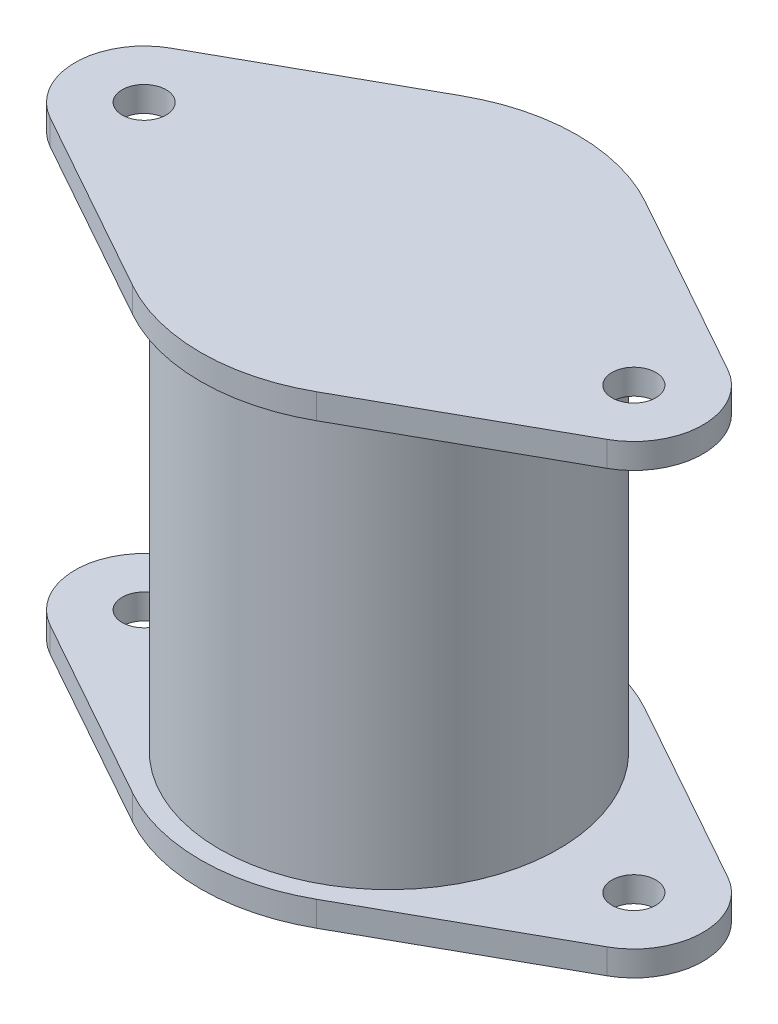
ISO-10303-21;
HEADER;
FILE_DESCRIPTION(('STEP AP214'),'2;1');
FILE_NAME('part.step','',(''),(''),'','','');
FILE_SCHEMA(('AUTOMOTIVE_DESIGN { 1 0 10303 214 1 1 1 1 }'));
ENDSEC;
DATA;
#1=APPLICATION_CONTEXT('core data for automotive mechanical design processes');
#2=APPLICATION_PROTOCOL_DEFINITION('international standard','automotive_design',2000,#1);
#3=PRODUCT_CONTEXT('',#1,'mechanical');
#4=PRODUCT('Part','Part','',(#3));
#5=PRODUCT_RELATED_PRODUCT_CATEGORY('part','',(#4));
#6=PRODUCT_DEFINITION_FORMATION('','',#4);
#7=PRODUCT_DEFINITION_CONTEXT('part definition',#1,'design');
#8=PRODUCT_DEFINITION('design','',#6,#7);
#9=PRODUCT_DEFINITION_SHAPE('','',#8);
#10=(LENGTH_UNIT() NAMED_UNIT(*) SI_UNIT(.MILLI.,.METRE.));
#11=(NAMED_UNIT(*) PLANE_ANGLE_UNIT() SI_UNIT($,.RADIAN.));
#12=(NAMED_UNIT(*) SI_UNIT($,.STERADIAN.) SOLID_ANGLE_UNIT());
#13=UNCERTAINTY_MEASURE_WITH_UNIT(LENGTH_MEASURE(1.E-05),#10,'distance_accuracy_value','');
#14=(GEOMETRIC_REPRESENTATION_CONTEXT(3) GLOBAL_UNCERTAINTY_ASSIGNED_CONTEXT((#13)) GLOBAL_UNIT_ASSIGNED_CONTEXT((#10,
#11,#12)) REPRESENTATION_CONTEXT('',''));
#15=CARTESIAN_POINT('',(0.,0.,0.));
#16=DIRECTION('',(0.,0.,1.));
#17=DIRECTION('',(1.,0.,0.));
#18=AXIS2_PLACEMENT_3D('',#15,#16,#17);
#19=CARTESIAN_POINT('',(-7.30769230769231,-2.,13.0995279737895));
#20=DIRECTION('',(-0.487179487179487,0.,0.873301864919303));
#21=DIRECTION('',(0.873301864919303,0.,0.487179487179487));
#22=AXIS2_PLACEMENT_3D('',#19,#20,#21);
#23=PLANE('',#22);
#24=DIRECTION('',(0.873301864919303,0.,0.487179487179487));
#25=VECTOR('',#24,1.);
#26=CARTESIAN_POINT('',(-7.30769230769231,0.,13.0995279737895));
#27=LINE('',#26,#25);
#28=CARTESIAN_POINT('',(-22.1794871794872,0.,4.80316025705616));
#29=VERTEX_POINT('',#28);
#30=CARTESIAN_POINT('',(-7.30769230769231,0.,13.0995279737895));
#31=VERTEX_POINT('',#30);
#32=EDGE_CURVE('E156',#29,#31,#27,.T.);
#33=ORIENTED_EDGE('',*,*,#32,.F.);
#34=DIRECTION('',(0.,1.,0.));
#35=VECTOR('',#34,1.);
#36=CARTESIAN_POINT('',(-22.1794871794872,-2.,4.80316025705616));
#37=LINE('',#36,#35);
#38=CARTESIAN_POINT('',(-22.1794871794872,-2.,4.80316025705616));
#39=VERTEX_POINT('',#38);
#40=EDGE_CURVE('E11',#39,#29,#37,.T.);
#41=ORIENTED_EDGE('',*,*,#40,.F.);
#42=DIRECTION('',(0.873301864919303,0.,0.487179487179487));
#43=VECTOR('',#42,1.);
#44=CARTESIAN_POINT('',(-7.30769230769231,-2.,13.0995279737895));
#45=LINE('',#44,#43);
#46=CARTESIAN_POINT('',(-7.30769230769231,-2.,13.0995279737895));
#47=VERTEX_POINT('',#46);
#48=EDGE_CURVE('E184',#39,#47,#45,.T.);
#49=ORIENTED_EDGE('',*,*,#48,.T.);
#50=DIRECTION('',(0.,1.,0.));
#51=VECTOR('',#50,1.);
#52=CARTESIAN_POINT('',(-7.30769230769231,-2.,13.0995279737895));
#53=LINE('',#52,#51);
#54=EDGE_CURVE('E46',#47,#31,#53,.T.);
#55=ORIENTED_EDGE('',*,*,#54,.T.);
#56=EDGE_LOOP('',(#33,#41,#49,#55));
#57=FACE_BOUND('',#56,.T.);
#58=ADVANCED_FACE('F42',(#57),#23,.T.);
#59=CARTESIAN_POINT('',(-19.5,-2.,0.));
#60=DIRECTION('',(0.,1.,0.));
#61=DIRECTION('',(0.,0.,1.));
#62=AXIS2_PLACEMENT_3D('',#59,#60,#61);
#63=CYLINDRICAL_SURFACE('',#62,5.5);
#64=CARTESIAN_POINT('',(-19.5,0.,0.));
#65=DIRECTION('',(0.,1.,0.));
#66=DIRECTION('',(0.,0.,1.));
#67=AXIS2_PLACEMENT_3D('',#64,#65,#66);
#68=CIRCLE('',#67,5.5);
#69=CARTESIAN_POINT('',(-22.1794871794872,0.,-4.80316025705616));
#70=VERTEX_POINT('',#69);
#71=EDGE_CURVE('E174',#70,#29,#68,.T.);
#72=ORIENTED_EDGE('',*,*,#71,.F.);
#73=DIRECTION('',(0.,1.,0.));
#74=VECTOR('',#73,1.);
#75=CARTESIAN_POINT('',(-22.1794871794872,-2.,-4.80316025705616));
#76=LINE('',#75,#74);
#77=CARTESIAN_POINT('',(-22.1794871794872,-2.,-4.80316025705616));
#78=VERTEX_POINT('',#77);
#79=EDGE_CURVE('E52',#78,#70,#76,.T.);
#80=ORIENTED_EDGE('',*,*,#79,.F.);
#81=CARTESIAN_POINT('',(-19.5,-2.,0.));
#82=DIRECTION('',(0.,1.,0.));
#83=DIRECTION('',(0.,0.,1.));
#84=AXIS2_PLACEMENT_3D('',#81,#82,#83);
#85=CIRCLE('',#84,5.5);
#86=EDGE_CURVE('E134',#78,#39,#85,.T.);
#87=ORIENTED_EDGE('',*,*,#86,.T.);
#88=ORIENTED_EDGE('',*,*,#40,.T.);
#89=EDGE_LOOP('',(#72,#80,#87,#88));
#90=FACE_BOUND('',#89,.T.);
#91=ADVANCED_FACE('F222',(#90),#63,.T.);
#92=CARTESIAN_POINT('',(-7.30769230769231,-2.,-13.0995279737895));
#93=DIRECTION('',(0.487179487179487,0.,0.873301864919303));
#94=DIRECTION('',(0.873301864919303,0.,-0.487179487179487));
#95=AXIS2_PLACEMENT_3D('',#92,#93,#94);
#96=PLANE('',#95);
#97=DIRECTION('',(0.873301864919303,0.,-0.487179487179487));
#98=VECTOR('',#97,1.);
#99=CARTESIAN_POINT('',(-7.30769230769231,0.,-13.0995279737895));
#100=LINE('',#99,#98);
#101=CARTESIAN_POINT('',(-7.30769230769231,0.,-13.0995279737895));
#102=VERTEX_POINT('',#101);
#103=EDGE_CURVE('E137',#70,#102,#100,.T.);
#104=ORIENTED_EDGE('',*,*,#103,.T.);
#105=DIRECTION('',(0.,1.,0.));
#106=VECTOR('',#105,1.);
#107=CARTESIAN_POINT('',(-7.30769230769231,-2.,-13.0995279737895));
#108=LINE('',#107,#106);
#109=CARTESIAN_POINT('',(-7.30769230769231,-2.,-13.0995279737895));
#110=VERTEX_POINT('',#109);
#111=EDGE_CURVE('E124',#110,#102,#108,.T.);
#112=ORIENTED_EDGE('',*,*,#111,.F.);
#113=DIRECTION('',(0.873301864919303,0.,-0.487179487179487));
#114=VECTOR('',#113,1.);
#115=CARTESIAN_POINT('',(-7.30769230769231,-2.,-13.0995279737895));
#116=LINE('',#115,#114);
#117=EDGE_CURVE('E129',#78,#110,#116,.T.);
#118=ORIENTED_EDGE('',*,*,#117,.F.);
#119=ORIENTED_EDGE('',*,*,#79,.T.);
#120=EDGE_LOOP('',(#104,#112,#118,#119));
#121=FACE_BOUND('',#120,.T.);
#122=ADVANCED_FACE('F136',(#121),#96,.F.);
#123=CARTESIAN_POINT('',(0.,-2.,0.));
#124=DIRECTION('',(0.,1.,0.));
#125=DIRECTION('',(0.,0.,1.));
#126=AXIS2_PLACEMENT_3D('',#123,#124,#125);
#127=CYLINDRICAL_SURFACE('',#126,15.);
#128=CARTESIAN_POINT('',(0.,0.,0.));
#129=DIRECTION('',(0.,1.,0.));
#130=DIRECTION('',(0.,0.,1.));
#131=AXIS2_PLACEMENT_3D('',#128,#129,#130);
#132=CIRCLE('',#131,15.);
#133=CARTESIAN_POINT('',(7.3076923076923,0.,-13.0995279737895));
#134=VERTEX_POINT('',#133);
#135=EDGE_CURVE('E171',#102,#134,#132,.F.);
#136=ORIENTED_EDGE('',*,*,#135,.T.);
#137=DIRECTION('',(0.,1.,0.));
#138=VECTOR('',#137,1.);
#139=CARTESIAN_POINT('',(7.3076923076923,-2.,-13.0995279737895));
#140=LINE('',#139,#138);
#141=CARTESIAN_POINT('',(7.3076923076923,-2.,-13.0995279737895));
#142=VERTEX_POINT('',#141);
#143=EDGE_CURVE('E125',#142,#134,#140,.T.);
#144=ORIENTED_EDGE('',*,*,#143,.F.);
#145=CARTESIAN_POINT('',(0.,-2.,0.));
#146=DIRECTION('',(0.,1.,0.));
#147=DIRECTION('',(0.,0.,1.));
#148=AXIS2_PLACEMENT_3D('',#145,#146,#147);
#149=CIRCLE('',#148,15.);
#150=EDGE_CURVE('E119',#110,#142,#149,.F.);
#151=ORIENTED_EDGE('',*,*,#150,.F.);
#152=ORIENTED_EDGE('',*,*,#111,.T.);
#153=EDGE_LOOP('',(#136,#144,#151,#152));
#154=FACE_BOUND('',#153,.T.);
#155=ADVANCED_FACE('F122',(#154),#127,.T.);
#156=CARTESIAN_POINT('',(7.3076923076923,-2.,-13.0995279737895));
#157=DIRECTION('',(0.487179487179487,0.,-0.873301864919303));
#158=DIRECTION('',(-0.873301864919303,0.,-0.487179487179487));
#159=AXIS2_PLACEMENT_3D('',#156,#157,#158);
#160=PLANE('',#159);
#161=DIRECTION('',(-0.873301864919303,0.,-0.487179487179487));
#162=VECTOR('',#161,1.);
#163=CARTESIAN_POINT('',(7.3076923076923,0.,-13.0995279737895));
#164=LINE('',#163,#162);
#165=CARTESIAN_POINT('',(22.1794871794872,0.,-4.80316025705616));
#166=VERTEX_POINT('',#165);
#167=EDGE_CURVE('E168',#166,#134,#164,.T.);
#168=ORIENTED_EDGE('',*,*,#167,.F.);
#169=DIRECTION('',(0.,1.,0.));
#170=VECTOR('',#169,1.);
#171=CARTESIAN_POINT('',(22.1794871794872,-2.,-4.80316025705616));
#172=LINE('',#171,#170);
#173=CARTESIAN_POINT('',(22.1794871794872,-2.,-4.80316025705616));
#174=VERTEX_POINT('',#173);
#175=EDGE_CURVE('E140',#174,#166,#172,.T.);
#176=ORIENTED_EDGE('',*,*,#175,.F.);
#177=DIRECTION('',(-0.873301864919303,0.,-0.487179487179487));
#178=VECTOR('',#177,1.);
#179=CARTESIAN_POINT('',(7.3076923076923,-2.,-13.0995279737895));
#180=LINE('',#179,#178);
#181=EDGE_CURVE('E130',#174,#142,#180,.T.);
#182=ORIENTED_EDGE('',*,*,#181,.T.);
#183=ORIENTED_EDGE('',*,*,#143,.T.);
#184=EDGE_LOOP('',(#168,#176,#182,#183));
#185=FACE_BOUND('',#184,.T.);
#186=ADVANCED_FACE('F200',(#185),#160,.T.);
#187=CARTESIAN_POINT('',(19.5,-2.,0.));
#188=DIRECTION('',(0.,1.,0.));
#189=DIRECTION('',(0.,0.,1.));
#190=AXIS2_PLACEMENT_3D('',#187,#188,#189);
#191=CYLINDRICAL_SURFACE('',#190,5.5);
#192=CARTESIAN_POINT('',(19.5,0.,0.));
#193=DIRECTION('',(0.,1.,0.));
#194=DIRECTION('',(0.,0.,1.));
#195=AXIS2_PLACEMENT_3D('',#192,#193,#194);
#196=CIRCLE('',#195,5.5);
#197=CARTESIAN_POINT('',(22.1794871794872,0.,4.80316025705616));
#198=VERTEX_POINT('',#197);
#199=EDGE_CURVE('E165',#198,#166,#196,.T.);
#200=ORIENTED_EDGE('',*,*,#199,.F.);
#201=DIRECTION('',(0.,1.,0.));
#202=VECTOR('',#201,1.);
#203=CARTESIAN_POINT('',(22.1794871794872,-2.,4.80316025705616));
#204=LINE('',#203,#202);
#205=CARTESIAN_POINT('',(22.1794871794872,-2.,4.80316025705616));
#206=VERTEX_POINT('',#205);
#207=EDGE_CURVE('E144',#206,#198,#204,.T.);
#208=ORIENTED_EDGE('',*,*,#207,.F.);
#209=CARTESIAN_POINT('',(19.5,-2.,0.));
#210=DIRECTION('',(0.,1.,0.));
#211=DIRECTION('',(0.,0.,1.));
#212=AXIS2_PLACEMENT_3D('',#209,#210,#211);
#213=CIRCLE('',#212,5.5);
#214=EDGE_CURVE('E195',#206,#174,#213,.T.);
#215=ORIENTED_EDGE('',*,*,#214,.T.);
#216=ORIENTED_EDGE('',*,*,#175,.T.);
#217=EDGE_LOOP('',(#200,#208,#215,#216));
#218=FACE_BOUND('',#217,.T.);
#219=ADVANCED_FACE('F205',(#218),#191,.T.);
#220=CARTESIAN_POINT('',(7.3076923076923,-2.,13.0995279737895));
#221=DIRECTION('',(0.487179487179487,0.,0.873301864919303));
#222=DIRECTION('',(0.873301864919303,0.,-0.487179487179487));
#223=AXIS2_PLACEMENT_3D('',#220,#221,#222);
#224=PLANE('',#223);
#225=DIRECTION('',(0.873301864919303,0.,-0.487179487179487));
#226=VECTOR('',#225,1.);
#227=CARTESIAN_POINT('',(7.3076923076923,0.,13.0995279737895));
#228=LINE('',#227,#226);
#229=CARTESIAN_POINT('',(7.3076923076923,0.,13.0995279737895));
#230=VERTEX_POINT('',#229);
#231=EDGE_CURVE('E162',#230,#198,#228,.T.);
#232=ORIENTED_EDGE('',*,*,#231,.F.);
#233=DIRECTION('',(0.,1.,0.));
#234=VECTOR('',#233,1.);
#235=CARTESIAN_POINT('',(7.3076923076923,-2.,13.0995279737895));
#236=LINE('',#235,#234);
#237=CARTESIAN_POINT('',(7.3076923076923,-2.,13.0995279737895));
#238=VERTEX_POINT('',#237);
#239=EDGE_CURVE('E145',#238,#230,#236,.T.);
#240=ORIENTED_EDGE('',*,*,#239,.F.);
#241=DIRECTION('',(0.873301864919303,0.,-0.487179487179487));
#242=VECTOR('',#241,1.);
#243=CARTESIAN_POINT('',(7.3076923076923,-2.,13.0995279737895));
#244=LINE('',#243,#242);
#245=EDGE_CURVE('E192',#238,#206,#244,.T.);
#246=ORIENTED_EDGE('',*,*,#245,.T.);
#247=ORIENTED_EDGE('',*,*,#207,.T.);
#248=EDGE_LOOP('',(#232,#240,#246,#247));
#249=FACE_BOUND('',#248,.T.);
#250=ADVANCED_FACE('F207',(#249),#224,.T.);
#251=CARTESIAN_POINT('',(19.5,-2.,0.));
#252=DIRECTION('',(0.,1.,0.));
#253=DIRECTION('',(0.,0.,1.));
#254=AXIS2_PLACEMENT_3D('',#251,#252,#253);
#255=CYLINDRICAL_SURFACE('',#254,1.75);
#256=CARTESIAN_POINT('',(19.5,-2.,0.));
#257=DIRECTION('',(0.,1.,0.));
#258=DIRECTION('',(0.,0.,1.));
#259=AXIS2_PLACEMENT_3D('',#256,#257,#258);
#260=CIRCLE('',#259,1.75);
#261=CARTESIAN_POINT('',(19.5,-2.,1.75));
#262=VERTEX_POINT('',#261);
#263=EDGE_CURVE('E179',#262,#262,#260,.T.);
#264=ORIENTED_EDGE('',*,*,#263,.F.);
#265=EDGE_LOOP('',(#264));
#266=FACE_BOUND('',#265,.T.);
#267=CARTESIAN_POINT('',(19.5,0.,0.));
#268=DIRECTION('',(0.,1.,0.));
#269=DIRECTION('',(0.,0.,1.));
#270=AXIS2_PLACEMENT_3D('',#267,#268,#269);
#271=CIRCLE('',#270,1.75);
#272=CARTESIAN_POINT('',(19.5,0.,1.75));
#273=VERTEX_POINT('',#272);
#274=EDGE_CURVE('E152',#273,#273,#271,.T.);
#275=ORIENTED_EDGE('',*,*,#274,.T.);
#276=EDGE_LOOP('',(#275));
#277=FACE_BOUND('',#276,.T.);
#278=ADVANCED_FACE('F217',(#266,#277),#255,.F.);
#279=CARTESIAN_POINT('',(-19.5,-2.,0.));
#280=DIRECTION('',(0.,1.,0.));
#281=DIRECTION('',(0.,0.,1.));
#282=AXIS2_PLACEMENT_3D('',#279,#280,#281);
#283=CYLINDRICAL_SURFACE('',#282,1.75);
#284=CARTESIAN_POINT('',(-19.5,-2.,0.));
#285=DIRECTION('',(0.,1.,0.));
#286=DIRECTION('',(0.,0.,1.));
#287=AXIS2_PLACEMENT_3D('',#284,#285,#286);
#288=CIRCLE('',#287,1.75);
#289=CARTESIAN_POINT('',(-19.5,-2.,1.75));
#290=VERTEX_POINT('',#289);
#291=EDGE_CURVE('E176',#290,#290,#288,.T.);
#292=ORIENTED_EDGE('',*,*,#291,.F.);
#293=EDGE_LOOP('',(#292));
#294=FACE_BOUND('',#293,.T.);
#295=CARTESIAN_POINT('',(-19.5,0.,0.));
#296=DIRECTION('',(0.,1.,0.));
#297=DIRECTION('',(0.,0.,1.));
#298=AXIS2_PLACEMENT_3D('',#295,#296,#297);
#299=CIRCLE('',#298,1.75);
#300=CARTESIAN_POINT('',(-19.5,0.,1.75));
#301=VERTEX_POINT('',#300);
#302=EDGE_CURVE('E149',#301,#301,#299,.T.);
#303=ORIENTED_EDGE('',*,*,#302,.T.);
#304=EDGE_LOOP('',(#303));
#305=FACE_BOUND('',#304,.T.);
#306=ADVANCED_FACE('F44',(#294,#305),#283,.F.);
#307=CARTESIAN_POINT('',(0.,-2.,0.));
#308=DIRECTION('',(0.,1.,0.));
#309=DIRECTION('',(0.,0.,1.));
#310=AXIS2_PLACEMENT_3D('',#307,#308,#309);
#311=CYLINDRICAL_SURFACE('',#310,15.);
#312=CARTESIAN_POINT('',(0.,0.,0.));
#313=DIRECTION('',(0.,1.,0.));
#314=DIRECTION('',(0.,0.,1.));
#315=AXIS2_PLACEMENT_3D('',#312,#313,#314);
#316=CIRCLE('',#315,15.);
#317=EDGE_CURVE('E159',#31,#230,#316,.T.);
#318=ORIENTED_EDGE('',*,*,#317,.F.);
#319=ORIENTED_EDGE('',*,*,#54,.F.);
#320=CARTESIAN_POINT('',(0.,-2.,0.));
#321=DIRECTION('',(0.,1.,0.));
#322=DIRECTION('',(0.,0.,1.));
#323=AXIS2_PLACEMENT_3D('',#320,#321,#322);
#324=CIRCLE('',#323,15.);
#325=EDGE_CURVE('E190',#47,#238,#324,.T.);
#326=ORIENTED_EDGE('',*,*,#325,.T.);
#327=ORIENTED_EDGE('',*,*,#239,.T.);
#328=EDGE_LOOP('',(#318,#319,#326,#327));
#329=FACE_BOUND('',#328,.T.);
#330=ADVANCED_FACE('F208',(#329),#311,.T.);
#331=CARTESIAN_POINT('',(0.,-2.,0.));
#332=DIRECTION('',(0.,1.,0.));
#333=DIRECTION('',(0.,0.,1.));
#334=AXIS2_PLACEMENT_3D('',#331,#332,#333);
#335=PLANE('',#334);
#336=ORIENTED_EDGE('',*,*,#291,.T.);
#337=EDGE_LOOP('',(#336));
#338=FACE_BOUND('',#337,.T.);
#339=ORIENTED_EDGE('',*,*,#263,.T.);
#340=EDGE_LOOP('',(#339));
#341=FACE_BOUND('',#340,.T.);
#342=ORIENTED_EDGE('',*,*,#48,.F.);
#343=ORIENTED_EDGE('',*,*,#86,.F.);
#344=ORIENTED_EDGE('',*,*,#117,.T.);
#345=ORIENTED_EDGE('',*,*,#150,.T.);
#346=ORIENTED_EDGE('',*,*,#181,.F.);
#347=ORIENTED_EDGE('',*,*,#214,.F.);
#348=ORIENTED_EDGE('',*,*,#245,.F.);
#349=ORIENTED_EDGE('',*,*,#325,.F.);
#350=EDGE_LOOP('',(#342,#343,#344,#345,#346,#347,#348,#349));
#351=FACE_BOUND('',#350,.T.);
#352=ADVANCED_FACE('F133',(#338,#341,#351),#335,.F.);
#353=CARTESIAN_POINT('',(0.,0.,0.));
#354=DIRECTION('',(0.,1.,0.));
#355=DIRECTION('',(0.,0.,1.));
#356=AXIS2_PLACEMENT_3D('',#353,#354,#355);
#357=PLANE('',#356);
#358=CARTESIAN_POINT('',(0.,0.,0.));
#359=DIRECTION('',(0.,1.,0.));
#360=DIRECTION('',(0.,0.,1.));
#361=AXIS2_PLACEMENT_3D('',#358,#359,#360);
#362=CIRCLE('',#361,13.5);
#363=CARTESIAN_POINT('',(0.,0.,13.5));
#364=VERTEX_POINT('',#363);
#365=EDGE_CURVE('E153',#364,#364,#362,.T.);
#366=ORIENTED_EDGE('',*,*,#365,.F.);
#367=EDGE_LOOP('',(#366));
#368=FACE_BOUND('',#367,.T.);
#369=ORIENTED_EDGE('',*,*,#302,.F.);
#370=EDGE_LOOP('',(#369));
#371=FACE_BOUND('',#370,.T.);
#372=ORIENTED_EDGE('',*,*,#274,.F.);
#373=EDGE_LOOP('',(#372));
#374=FACE_BOUND('',#373,.T.);
#375=ORIENTED_EDGE('',*,*,#32,.T.);
#376=ORIENTED_EDGE('',*,*,#317,.T.);
#377=ORIENTED_EDGE('',*,*,#231,.T.);
#378=ORIENTED_EDGE('',*,*,#199,.T.);
#379=ORIENTED_EDGE('',*,*,#167,.T.);
#380=ORIENTED_EDGE('',*,*,#135,.F.);
#381=ORIENTED_EDGE('',*,*,#103,.F.);
#382=ORIENTED_EDGE('',*,*,#71,.T.);
#383=EDGE_LOOP('',(#375,#376,#377,#378,#379,#380,#381,#382));
#384=FACE_BOUND('',#383,.T.);
#385=ADVANCED_FACE('F215',(#368,#371,#374,#384),#357,.T.);
#386=CARTESIAN_POINT('',(0.,16.5,0.));
#387=DIRECTION('',(0.,-1.,0.));
#388=DIRECTION('',(0.,0.,-1.));
#389=AXIS2_PLACEMENT_3D('',#386,#387,#388);
#390=CYLINDRICAL_SURFACE('',#389,13.5);
#391=ORIENTED_EDGE('',*,*,#365,.T.);
#392=EDGE_LOOP('',(#391));
#393=FACE_BOUND('',#392,.T.);
#394=CARTESIAN_POINT('',(0.,33.,0.));
#395=DIRECTION('',(0.,1.,0.));
#396=DIRECTION('',(0.,0.,1.));
#397=AXIS2_PLACEMENT_3D('',#394,#395,#396);
#398=CIRCLE('',#397,13.5);
#399=CARTESIAN_POINT('',(0.,33.,13.5));
#400=VERTEX_POINT('',#399);
#401=EDGE_CURVE('E458',#400,#400,#398,.T.);
#402=ORIENTED_EDGE('',*,*,#401,.F.);
#403=EDGE_LOOP('',(#402));
#404=FACE_BOUND('',#403,.T.);
#405=ADVANCED_FACE('F237',(#393,#404),#390,.T.);
#406=CARTESIAN_POINT('',(-7.30769230769231,35.,13.0995279737895));
#407=DIRECTION('',(-0.487179487179487,0.,0.873301864919303));
#408=DIRECTION('',(0.873301864919303,0.,0.487179487179487));
#409=AXIS2_PLACEMENT_3D('',#406,#407,#408);
#410=PLANE('',#409);
#411=DIRECTION('',(0.873301864919303,0.,0.487179487179487));
#412=VECTOR('',#411,1.);
#413=CARTESIAN_POINT('',(-7.30769230769231,33.,13.0995279737895));
#414=LINE('',#413,#412);
#415=CARTESIAN_POINT('',(-22.1794871794872,33.,4.80316025705616));
#416=VERTEX_POINT('',#415);
#417=CARTESIAN_POINT('',(-7.30769230769231,33.,13.0995279737895));
#418=VERTEX_POINT('',#417);
#419=EDGE_CURVE('E471',#416,#418,#414,.T.);
#420=ORIENTED_EDGE('',*,*,#419,.T.);
#421=DIRECTION('',(0.,-1.,0.));
#422=VECTOR('',#421,1.);
#423=CARTESIAN_POINT('',(-7.30769230769231,35.,13.0995279737895));
#424=LINE('',#423,#422);
#425=CARTESIAN_POINT('',(-7.30769230769231,35.,13.0995279737895));
#426=VERTEX_POINT('',#425);
#427=EDGE_CURVE('E524',#426,#418,#424,.T.);
#428=ORIENTED_EDGE('',*,*,#427,.F.);
#429=DIRECTION('',(0.873301864919303,0.,0.487179487179487));
#430=VECTOR('',#429,1.);
#431=CARTESIAN_POINT('',(-7.30769230769231,35.,13.0995279737895));
#432=LINE('',#431,#430);
#433=CARTESIAN_POINT('',(-22.1794871794872,35.,4.80316025705616));
#434=VERTEX_POINT('',#433);
#435=EDGE_CURVE('E546',#434,#426,#432,.T.);
#436=ORIENTED_EDGE('',*,*,#435,.F.);
#437=DIRECTION('',(0.,-1.,0.));
#438=VECTOR('',#437,1.);
#439=CARTESIAN_POINT('',(-22.1794871794872,35.,4.80316025705616));
#440=LINE('',#439,#438);
#441=EDGE_CURVE('E505',#434,#416,#440,.T.);
#442=ORIENTED_EDGE('',*,*,#441,.T.);
#443=EDGE_LOOP('',(#420,#428,#436,#442));
#444=FACE_BOUND('',#443,.T.);
#445=ADVANCED_FACE('F243',(#444),#410,.T.);
#446=CARTESIAN_POINT('',(-19.5,35.,0.));
#447=DIRECTION('',(0.,-1.,0.));
#448=DIRECTION('',(0.,0.,1.));
#449=AXIS2_PLACEMENT_3D('',#446,#447,#448);
#450=CYLINDRICAL_SURFACE('',#449,5.5);
#451=CARTESIAN_POINT('',(-19.5,33.,0.));
#452=DIRECTION('',(0.,1.,0.));
#453=DIRECTION('',(0.,0.,1.));
#454=AXIS2_PLACEMENT_3D('',#451,#452,#453);
#455=CIRCLE('',#454,5.5);
#456=CARTESIAN_POINT('',(-22.1794871794872,33.,-4.80316025705616));
#457=VERTEX_POINT('',#456);
#458=EDGE_CURVE('E475',#457,#416,#455,.T.);
#459=ORIENTED_EDGE('',*,*,#458,.T.);
#460=ORIENTED_EDGE('',*,*,#441,.F.);
#461=CARTESIAN_POINT('',(-19.5,35.,0.));
#462=DIRECTION('',(0.,1.,0.));
#463=DIRECTION('',(0.,0.,1.));
#464=AXIS2_PLACEMENT_3D('',#461,#462,#463);
#465=CIRCLE('',#464,5.5);
#466=CARTESIAN_POINT('',(-22.1794871794872,35.,-4.80316025705616));
#467=VERTEX_POINT('',#466);
#468=EDGE_CURVE('E525',#467,#434,#465,.T.);
#469=ORIENTED_EDGE('',*,*,#468,.F.);
#470=DIRECTION('',(0.,-1.,0.));
#471=VECTOR('',#470,1.);
#472=CARTESIAN_POINT('',(-22.1794871794872,35.,-4.80316025705616));
#473=LINE('',#472,#471);
#474=EDGE_CURVE('E507',#467,#457,#473,.T.);
#475=ORIENTED_EDGE('',*,*,#474,.T.);
#476=EDGE_LOOP('',(#459,#460,#469,#475));
#477=FACE_BOUND('',#476,.T.);
#478=ADVANCED_FACE('F318',(#477),#450,.T.);
#479=CARTESIAN_POINT('',(-7.30769230769231,35.,-13.0995279737895));
#480=DIRECTION('',(0.487179487179487,0.,0.873301864919303));
#481=DIRECTION('',(0.873301864919303,0.,-0.487179487179487));
#482=AXIS2_PLACEMENT_3D('',#479,#480,#481);
#483=PLANE('',#482);
#484=DIRECTION('',(0.873301864919303,0.,-0.487179487179487));
#485=VECTOR('',#484,1.);
#486=CARTESIAN_POINT('',(-7.30769230769231,33.,-13.0995279737895));
#487=LINE('',#486,#485);
#488=CARTESIAN_POINT('',(-7.30769230769231,33.,-13.0995279737895));
#489=VERTEX_POINT('',#488);
#490=EDGE_CURVE('E501',#457,#489,#487,.T.);
#491=ORIENTED_EDGE('',*,*,#490,.F.);
#492=ORIENTED_EDGE('',*,*,#474,.F.);
#493=DIRECTION('',(0.873301864919303,0.,-0.487179487179487));
#494=VECTOR('',#493,1.);
#495=CARTESIAN_POINT('',(-7.30769230769231,35.,-13.0995279737895));
#496=LINE('',#495,#494);
#497=CARTESIAN_POINT('',(-7.30769230769231,35.,-13.0995279737895));
#498=VERTEX_POINT('',#497);
#499=EDGE_CURVE('E528',#467,#498,#496,.T.);
#500=ORIENTED_EDGE('',*,*,#499,.T.);
#501=DIRECTION('',(0.,-1.,0.));
#502=VECTOR('',#501,1.);
#503=CARTESIAN_POINT('',(-7.30769230769231,35.,-13.0995279737895));
#504=LINE('',#503,#502);
#505=EDGE_CURVE('E510',#498,#489,#504,.T.);
#506=ORIENTED_EDGE('',*,*,#505,.T.);
#507=EDGE_LOOP('',(#491,#492,#500,#506));
#508=FACE_BOUND('',#507,.T.);
#509=ADVANCED_FACE('F328',(#508),#483,.F.);
#510=CARTESIAN_POINT('',(0.,35.,0.));
#511=DIRECTION('',(0.,-1.,0.));
#512=DIRECTION('',(0.,0.,1.));
#513=AXIS2_PLACEMENT_3D('',#510,#511,#512);
#514=CYLINDRICAL_SURFACE('',#513,15.);
#515=CARTESIAN_POINT('',(0.,33.,0.));
#516=DIRECTION('',(0.,1.,0.));
#517=DIRECTION('',(0.,0.,1.));
#518=AXIS2_PLACEMENT_3D('',#515,#516,#517);
#519=CIRCLE('',#518,15.);
#520=CARTESIAN_POINT('',(7.3076923076923,33.,-13.0995279737895));
#521=VERTEX_POINT('',#520);
#522=EDGE_CURVE('E498',#489,#521,#519,.F.);
#523=ORIENTED_EDGE('',*,*,#522,.F.);
#524=ORIENTED_EDGE('',*,*,#505,.F.);
#525=CARTESIAN_POINT('',(0.,35.,0.));
#526=DIRECTION('',(0.,1.,0.));
#527=DIRECTION('',(0.,0.,1.));
#528=AXIS2_PLACEMENT_3D('',#525,#526,#527);
#529=CIRCLE('',#528,15.);
#530=CARTESIAN_POINT('',(7.3076923076923,35.,-13.0995279737895));
#531=VERTEX_POINT('',#530);
#532=EDGE_CURVE('E536',#498,#531,#529,.F.);
#533=ORIENTED_EDGE('',*,*,#532,.T.);
#534=DIRECTION('',(0.,-1.,0.));
#535=VECTOR('',#534,1.);
#536=CARTESIAN_POINT('',(7.3076923076923,35.,-13.0995279737895));
#537=LINE('',#536,#535);
#538=EDGE_CURVE('E513',#531,#521,#537,.T.);
#539=ORIENTED_EDGE('',*,*,#538,.T.);
#540=EDGE_LOOP('',(#523,#524,#533,#539));
#541=FACE_BOUND('',#540,.T.);
#542=ADVANCED_FACE('F339',(#541),#514,.T.);
#543=CARTESIAN_POINT('',(7.3076923076923,35.,-13.0995279737895));
#544=DIRECTION('',(0.487179487179487,0.,-0.873301864919303));
#545=DIRECTION('',(-0.873301864919303,0.,-0.487179487179487));
#546=AXIS2_PLACEMENT_3D('',#543,#544,#545);
#547=PLANE('',#546);
#548=DIRECTION('',(-0.873301864919303,0.,-0.487179487179487));
#549=VECTOR('',#548,1.);
#550=CARTESIAN_POINT('',(7.3076923076923,33.,-13.0995279737895));
#551=LINE('',#550,#549);
#552=CARTESIAN_POINT('',(22.1794871794872,33.,-4.80316025705616));
#553=VERTEX_POINT('',#552);
#554=EDGE_CURVE('E495',#553,#521,#551,.T.);
#555=ORIENTED_EDGE('',*,*,#554,.T.);
#556=ORIENTED_EDGE('',*,*,#538,.F.);
#557=DIRECTION('',(-0.873301864919303,0.,-0.487179487179487));
#558=VECTOR('',#557,1.);
#559=CARTESIAN_POINT('',(7.3076923076923,35.,-13.0995279737895));
#560=LINE('',#559,#558);
#561=CARTESIAN_POINT('',(22.1794871794872,35.,-4.80316025705616));
#562=VERTEX_POINT('',#561);
#563=EDGE_CURVE('E557',#562,#531,#560,.T.);
#564=ORIENTED_EDGE('',*,*,#563,.F.);
#565=DIRECTION('',(0.,-1.,0.));
#566=VECTOR('',#565,1.);
#567=CARTESIAN_POINT('',(22.1794871794872,35.,-4.80316025705616));
#568=LINE('',#567,#566);
#569=EDGE_CURVE('E516',#562,#553,#568,.T.);
#570=ORIENTED_EDGE('',*,*,#569,.T.);
#571=EDGE_LOOP('',(#555,#556,#564,#570));
#572=FACE_BOUND('',#571,.T.);
#573=ADVANCED_FACE('F350',(#572),#547,.T.);
#574=CARTESIAN_POINT('',(19.5,35.,0.));
#575=DIRECTION('',(0.,-1.,0.));
#576=DIRECTION('',(0.,0.,1.));
#577=AXIS2_PLACEMENT_3D('',#574,#575,#576);
#578=CYLINDRICAL_SURFACE('',#577,5.5);
#579=CARTESIAN_POINT('',(19.5,33.,0.));
#580=DIRECTION('',(0.,1.,0.));
#581=DIRECTION('',(0.,0.,1.));
#582=AXIS2_PLACEMENT_3D('',#579,#580,#581);
#583=CIRCLE('',#582,5.5);
#584=CARTESIAN_POINT('',(22.1794871794872,33.,4.80316025705616));
#585=VERTEX_POINT('',#584);
#586=EDGE_CURVE('E492',#585,#553,#583,.T.);
#587=ORIENTED_EDGE('',*,*,#586,.T.);
#588=ORIENTED_EDGE('',*,*,#569,.F.);
#589=CARTESIAN_POINT('',(19.5,35.,0.));
#590=DIRECTION('',(0.,1.,0.));
#591=DIRECTION('',(0.,0.,1.));
#592=AXIS2_PLACEMENT_3D('',#589,#590,#591);
#593=CIRCLE('',#592,5.5);
#594=CARTESIAN_POINT('',(22.1794871794872,35.,4.80316025705616));
#595=VERTEX_POINT('',#594);
#596=EDGE_CURVE('E554',#595,#562,#593,.T.);
#597=ORIENTED_EDGE('',*,*,#596,.F.);
#598=DIRECTION('',(0.,-1.,0.));
#599=VECTOR('',#598,1.);
#600=CARTESIAN_POINT('',(22.1794871794872,35.,4.80316025705616));
#601=LINE('',#600,#599);
#602=EDGE_CURVE('E519',#595,#585,#601,.T.);
#603=ORIENTED_EDGE('',*,*,#602,.T.);
#604=EDGE_LOOP('',(#587,#588,#597,#603));
#605=FACE_BOUND('',#604,.T.);
#606=ADVANCED_FACE('F361',(#605),#578,.T.);
#607=CARTESIAN_POINT('',(7.3076923076923,35.,13.0995279737895));
#608=DIRECTION('',(0.487179487179487,0.,0.873301864919303));
#609=DIRECTION('',(0.873301864919303,0.,-0.487179487179487));
#610=AXIS2_PLACEMENT_3D('',#607,#608,#609);
#611=PLANE('',#610);
#612=DIRECTION('',(0.873301864919303,0.,-0.487179487179487));
#613=VECTOR('',#612,1.);
#614=CARTESIAN_POINT('',(7.3076923076923,33.,13.0995279737895));
#615=LINE('',#614,#613);
#616=CARTESIAN_POINT('',(7.3076923076923,33.,13.0995279737895));
#617=VERTEX_POINT('',#616);
#618=EDGE_CURVE('E485',#617,#585,#615,.T.);
#619=ORIENTED_EDGE('',*,*,#618,.T.);
#620=ORIENTED_EDGE('',*,*,#602,.F.);
#621=DIRECTION('',(0.873301864919303,0.,-0.487179487179487));
#622=VECTOR('',#621,1.);
#623=CARTESIAN_POINT('',(7.3076923076923,35.,13.0995279737895));
#624=LINE('',#623,#622);
#625=CARTESIAN_POINT('',(7.3076923076923,35.,13.0995279737895));
#626=VERTEX_POINT('',#625);
#627=EDGE_CURVE('E551',#626,#595,#624,.T.);
#628=ORIENTED_EDGE('',*,*,#627,.F.);
#629=DIRECTION('',(0.,-1.,0.));
#630=VECTOR('',#629,1.);
#631=CARTESIAN_POINT('',(7.3076923076923,35.,13.0995279737895));
#632=LINE('',#631,#630);
#633=EDGE_CURVE('E522',#626,#617,#632,.T.);
#634=ORIENTED_EDGE('',*,*,#633,.T.);
#635=EDGE_LOOP('',(#619,#620,#628,#634));
#636=FACE_BOUND('',#635,.T.);
#637=ADVANCED_FACE('F372',(#636),#611,.T.);
#638=CARTESIAN_POINT('',(19.5,35.,0.));
#639=DIRECTION('',(0.,-1.,0.));
#640=DIRECTION('',(0.,0.,1.));
#641=AXIS2_PLACEMENT_3D('',#638,#639,#640);
#642=CYLINDRICAL_SURFACE('',#641,1.75);
#643=CARTESIAN_POINT('',(19.5,35.,0.));
#644=DIRECTION('',(0.,1.,0.));
#645=DIRECTION('',(0.,0.,1.));
#646=AXIS2_PLACEMENT_3D('',#643,#644,#645);
#647=CIRCLE('',#646,1.75);
#648=CARTESIAN_POINT('',(19.5,35.,1.75));
#649=VERTEX_POINT('',#648);
#650=EDGE_CURVE('E543',#649,#649,#647,.T.);
#651=ORIENTED_EDGE('',*,*,#650,.T.);
#652=EDGE_LOOP('',(#651));
#653=FACE_BOUND('',#652,.T.);
#654=CARTESIAN_POINT('',(19.5,33.,0.));
#655=DIRECTION('',(0.,1.,0.));
#656=DIRECTION('',(0.,0.,1.));
#657=AXIS2_PLACEMENT_3D('',#654,#655,#656);
#658=CIRCLE('',#657,1.75);
#659=CARTESIAN_POINT('',(19.5,33.,1.75));
#660=VERTEX_POINT('',#659);
#661=EDGE_CURVE('E466',#660,#660,#658,.T.);
#662=ORIENTED_EDGE('',*,*,#661,.F.);
#663=EDGE_LOOP('',(#662));
#664=FACE_BOUND('',#663,.T.);
#665=ADVANCED_FACE('F383',(#653,#664),#642,.F.);
#666=CARTESIAN_POINT('',(-19.5,35.,0.));
#667=DIRECTION('',(0.,-1.,0.));
#668=DIRECTION('',(0.,0.,1.));
#669=AXIS2_PLACEMENT_3D('',#666,#667,#668);
#670=CYLINDRICAL_SURFACE('',#669,1.75);
#671=CARTESIAN_POINT('',(-19.5,35.,0.));
#672=DIRECTION('',(0.,1.,0.));
#673=DIRECTION('',(0.,0.,1.));
#674=AXIS2_PLACEMENT_3D('',#671,#672,#673);
#675=CIRCLE('',#674,1.75);
#676=CARTESIAN_POINT('',(-19.5,35.,1.75));
#677=VERTEX_POINT('',#676);
#678=EDGE_CURVE('E504',#677,#677,#675,.T.);
#679=ORIENTED_EDGE('',*,*,#678,.T.);
#680=EDGE_LOOP('',(#679));
#681=FACE_BOUND('',#680,.T.);
#682=CARTESIAN_POINT('',(-19.5,33.,0.));
#683=DIRECTION('',(0.,1.,0.));
#684=DIRECTION('',(0.,0.,1.));
#685=AXIS2_PLACEMENT_3D('',#682,#683,#684);
#686=CIRCLE('',#685,1.75);
#687=CARTESIAN_POINT('',(-19.5,33.,1.75));
#688=VERTEX_POINT('',#687);
#689=EDGE_CURVE('E462',#688,#688,#686,.T.);
#690=ORIENTED_EDGE('',*,*,#689,.F.);
#691=EDGE_LOOP('',(#690));
#692=FACE_BOUND('',#691,.T.);
#693=ADVANCED_FACE('F394',(#681,#692),#670,.F.);
#694=CARTESIAN_POINT('',(0.,35.,0.));
#695=DIRECTION('',(0.,-1.,0.));
#696=DIRECTION('',(0.,0.,1.));
#697=AXIS2_PLACEMENT_3D('',#694,#695,#696);
#698=CYLINDRICAL_SURFACE('',#697,15.);
#699=CARTESIAN_POINT('',(0.,33.,0.));
#700=DIRECTION('',(0.,1.,0.));
#701=DIRECTION('',(0.,0.,1.));
#702=AXIS2_PLACEMENT_3D('',#699,#700,#701);
#703=CIRCLE('',#702,15.);
#704=EDGE_CURVE('E479',#418,#617,#703,.T.);
#705=ORIENTED_EDGE('',*,*,#704,.T.);
#706=ORIENTED_EDGE('',*,*,#633,.F.);
#707=CARTESIAN_POINT('',(0.,35.,0.));
#708=DIRECTION('',(0.,1.,0.));
#709=DIRECTION('',(0.,0.,1.));
#710=AXIS2_PLACEMENT_3D('',#707,#708,#709);
#711=CIRCLE('',#710,15.);
#712=EDGE_CURVE('E548',#426,#626,#711,.T.);
#713=ORIENTED_EDGE('',*,*,#712,.F.);
#714=ORIENTED_EDGE('',*,*,#427,.T.);
#715=EDGE_LOOP('',(#705,#706,#713,#714));
#716=FACE_BOUND('',#715,.T.);
#717=ADVANCED_FACE('F405',(#716),#698,.T.);
#718=CARTESIAN_POINT('',(0.,35.,0.));
#719=DIRECTION('',(0.,-1.,0.));
#720=DIRECTION('',(0.,0.,1.));
#721=AXIS2_PLACEMENT_3D('',#718,#719,#720);
#722=PLANE('',#721);
#723=ORIENTED_EDGE('',*,*,#678,.F.);
#724=EDGE_LOOP('',(#723));
#725=FACE_BOUND('',#724,.T.);
#726=ORIENTED_EDGE('',*,*,#650,.F.);
#727=EDGE_LOOP('',(#726));
#728=FACE_BOUND('',#727,.T.);
#729=ORIENTED_EDGE('',*,*,#435,.T.);
#730=ORIENTED_EDGE('',*,*,#712,.T.);
#731=ORIENTED_EDGE('',*,*,#627,.T.);
#732=ORIENTED_EDGE('',*,*,#596,.T.);
#733=ORIENTED_EDGE('',*,*,#563,.T.);
#734=ORIENTED_EDGE('',*,*,#532,.F.);
#735=ORIENTED_EDGE('',*,*,#499,.F.);
#736=ORIENTED_EDGE('',*,*,#468,.T.);
#737=EDGE_LOOP('',(#729,#730,#731,#732,#733,#734,#735,#736));
#738=FACE_BOUND('',#737,.T.);
#739=ADVANCED_FACE('F416',(#725,#728,#738),#722,.F.);
#740=CARTESIAN_POINT('',(0.,33.,0.));
#741=DIRECTION('',(0.,-1.,0.));
#742=DIRECTION('',(0.,0.,1.));
#743=AXIS2_PLACEMENT_3D('',#740,#741,#742);
#744=PLANE('',#743);
#745=ORIENTED_EDGE('',*,*,#401,.T.);
#746=EDGE_LOOP('',(#745));
#747=FACE_BOUND('',#746,.T.);
#748=ORIENTED_EDGE('',*,*,#689,.T.);
#749=EDGE_LOOP('',(#748));
#750=FACE_BOUND('',#749,.T.);
#751=ORIENTED_EDGE('',*,*,#661,.T.);
#752=EDGE_LOOP('',(#751));
#753=FACE_BOUND('',#752,.T.);
#754=ORIENTED_EDGE('',*,*,#419,.F.);
#755=ORIENTED_EDGE('',*,*,#458,.F.);
#756=ORIENTED_EDGE('',*,*,#490,.T.);
#757=ORIENTED_EDGE('',*,*,#522,.T.);
#758=ORIENTED_EDGE('',*,*,#554,.F.);
#759=ORIENTED_EDGE('',*,*,#586,.F.);
#760=ORIENTED_EDGE('',*,*,#618,.F.);
#761=ORIENTED_EDGE('',*,*,#704,.F.);
#762=EDGE_LOOP('',(#754,#755,#756,#757,#758,#759,#760,#761));
#763=FACE_BOUND('',#762,.T.);
#764=ADVANCED_FACE('F427',(#747,#750,#753,#763),#744,.T.);
#765=CLOSED_SHELL('',(#58,#91,#122,#155,#186,#219,#250,#278,#306,#330,#352,#385,#405,#445,#478,
#509,#542,#573,#606,#637,#665,#693,#717,#739,#764));
#766=MANIFOLD_SOLID_BREP('B2',#765);
#767=ADVANCED_BREP_SHAPE_REPRESENTATION('',(#18,#766),#14);
#768=SHAPE_DEFINITION_REPRESENTATION(#9,#767);
ENDSEC;
END-ISO-10303-21;
